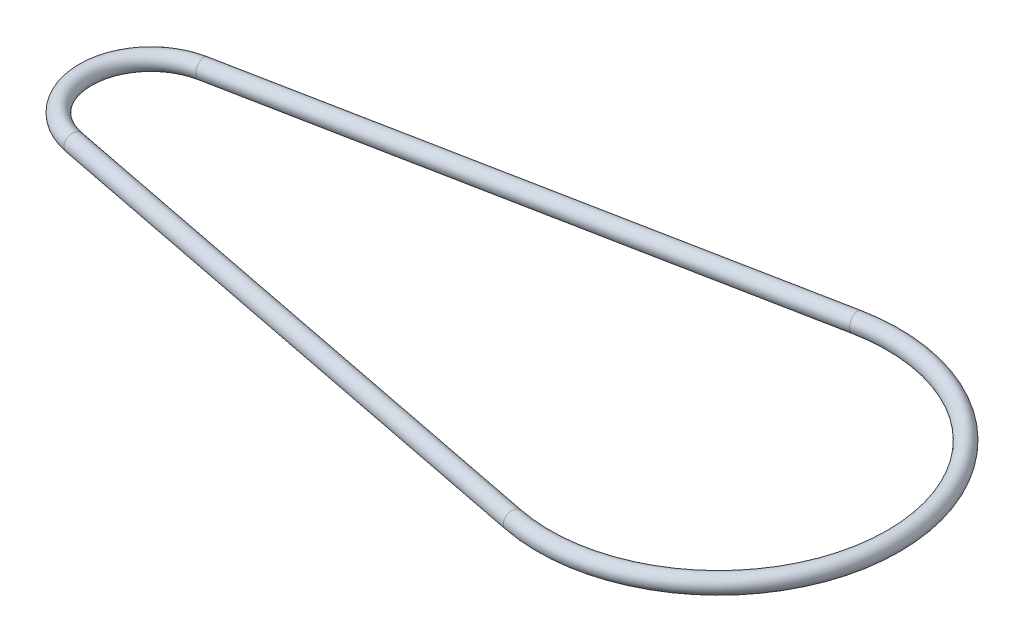
ISO-10303-21;
HEADER;
FILE_DESCRIPTION(('STEP AP214'),'2;1');
FILE_NAME('part.step','',(''),(''),'','','');
FILE_SCHEMA(('AUTOMOTIVE_DESIGN { 1 0 10303 214 1 1 1 1 }'));
ENDSEC;
DATA;
#1=APPLICATION_CONTEXT('core data for automotive mechanical design processes');
#2=APPLICATION_PROTOCOL_DEFINITION('international standard','automotive_design',2000,#1);
#3=PRODUCT_CONTEXT('',#1,'mechanical');
#4=PRODUCT('Part','Part','',(#3));
#5=PRODUCT_RELATED_PRODUCT_CATEGORY('part','',(#4));
#6=PRODUCT_DEFINITION_FORMATION('','',#4);
#7=PRODUCT_DEFINITION_CONTEXT('part definition',#1,'design');
#8=PRODUCT_DEFINITION('design','',#6,#7);
#9=PRODUCT_DEFINITION_SHAPE('','',#8);
#10=(LENGTH_UNIT() NAMED_UNIT(*) SI_UNIT(.MILLI.,.METRE.));
#11=(NAMED_UNIT(*) PLANE_ANGLE_UNIT() SI_UNIT($,.RADIAN.));
#12=(NAMED_UNIT(*) SI_UNIT($,.STERADIAN.) SOLID_ANGLE_UNIT());
#13=UNCERTAINTY_MEASURE_WITH_UNIT(LENGTH_MEASURE(1.E-05),#10,'distance_accuracy_value','');
#14=(GEOMETRIC_REPRESENTATION_CONTEXT(3) GLOBAL_UNCERTAINTY_ASSIGNED_CONTEXT((#13)) GLOBAL_UNIT_ASSIGNED_CONTEXT((#10,
#11,#12)) REPRESENTATION_CONTEXT('',''));
#15=CARTESIAN_POINT('',(0.,0.,0.));
#16=DIRECTION('',(0.,0.,1.));
#17=DIRECTION('',(1.,0.,0.));
#18=AXIS2_PLACEMENT_3D('',#15,#16,#17);
#19=CARTESIAN_POINT('',(0.,0.,0.));
#20=DIRECTION('',(0.,-1.,0.));
#21=DIRECTION('',(0.,0.,-1.));
#22=AXIS2_PLACEMENT_3D('',#19,#20,#21);
#23=TOROIDAL_SURFACE('',#22,7.5,1.);
#24=CARTESIAN_POINT('',(-1.44230769230795,0.,7.3600100897152));
#25=DIRECTION('',(-0.981334678628695,0.,-0.192307692307706));
#26=DIRECTION('',(-0.192307692307706,0.,0.981334678628695));
#27=AXIS2_PLACEMENT_3D('',#24,#25,#26);
#28=CIRCLE('',#27,1.);
#29=CARTESIAN_POINT('',(-1.63461538461564,0.,8.34134476834386));
#30=VERTEX_POINT('',#29);
#31=EDGE_CURVE('E25',#30,#30,#28,.T.);
#32=ORIENTED_EDGE('',*,*,#31,.T.);
#33=EDGE_LOOP('',(#32));
#34=FACE_BOUND('',#33,.T.);
#35=CARTESIAN_POINT('',(-1.44230769230766,0.,-7.36001008971521));
#36=DIRECTION('',(0.981334678628698,0.,-0.192307692307693));
#37=DIRECTION('',(-0.192307692307701,0.,-0.981334678628696));
#38=AXIS2_PLACEMENT_3D('',#35,#36,#37);
#39=CIRCLE('',#38,0.999999999999997);
#40=CARTESIAN_POINT('',(-1.63461538461536,0.,-8.3413447683439));
#41=VERTEX_POINT('',#40);
#42=EDGE_CURVE('E10',#41,#41,#39,.T.);
#43=ORIENTED_EDGE('',*,*,#42,.F.);
#44=EDGE_LOOP('',(#43));
#45=FACE_BOUND('',#44,.T.);
#46=ADVANCED_FACE('F15',(#34,#45),#23,.T.);
#47=CARTESIAN_POINT('',(61.1538461538459,0.,19.6266935725739));
#48=DIRECTION('',(-0.981334678628698,0.,-0.192307692307693));
#49=DIRECTION('',(-0.192307692307693,0.,0.981334678628698));
#50=AXIS2_PLACEMENT_3D('',#47,#48,#49);
#51=CYLINDRICAL_SURFACE('',#50,1.);
#52=CARTESIAN_POINT('',(61.1538461538459,0.,19.6266935725739));
#53=DIRECTION('',(-0.981334678628695,0.,-0.192307692307706));
#54=DIRECTION('',(-0.192307692307706,0.,0.981334678628695));
#55=AXIS2_PLACEMENT_3D('',#52,#53,#54);
#56=CIRCLE('',#55,1.);
#57=CARTESIAN_POINT('',(60.9615384615382,0.,20.6080282512026));
#58=VERTEX_POINT('',#57);
#59=EDGE_CURVE('E29',#58,#58,#56,.T.);
#60=CARTESIAN_POINT('',(60.9615384615382,0.,20.6080282512026));
#61=CARTESIAN_POINT('',(60.3094951923074,0.,20.4802502982562));
#62=CARTESIAN_POINT('',(59.6574519230767,0.,20.3524723453097));
#63=CARTESIAN_POINT('',(58.3533653846151,0.,20.0969164394168));
#64=CARTESIAN_POINT('',(57.7013221153844,0.,19.9691384864704));
#65=CARTESIAN_POINT('',(56.3972355769228,0.,19.7135825805775));
#66=CARTESIAN_POINT('',(55.745192307692,0.,19.585804627631));
#67=CARTESIAN_POINT('',(54.4411057692305,0.,19.3302487217381));
#68=CARTESIAN_POINT('',(53.7890624999997,0.,19.2024707687917));
#69=CARTESIAN_POINT('',(52.4849759615382,0.,18.9469148628988));
#70=CARTESIAN_POINT('',(51.8329326923074,0.,18.8191369099524));
#71=CARTESIAN_POINT('',(50.5288461538459,0.,18.5635810040595));
#72=CARTESIAN_POINT('',(49.8768028846151,0.,18.435803051113));
#73=CARTESIAN_POINT('',(48.5727163461536,0.,18.1802471452201));
#74=CARTESIAN_POINT('',(47.9206730769228,0.,18.0524691922737));
#75=CARTESIAN_POINT('',(46.6165865384613,0.,17.7969132863808));
#76=CARTESIAN_POINT('',(45.9645432692305,0.,17.6691353334344));
#77=CARTESIAN_POINT('',(44.660456730769,0.,17.4135794275415));
#78=CARTESIAN_POINT('',(44.0084134615382,0.,17.285801474595));
#79=CARTESIAN_POINT('',(42.7043269230767,0.,17.0302455687021));
#80=CARTESIAN_POINT('',(42.0522836538459,0.,16.9024676157557));
#81=CARTESIAN_POINT('',(40.7481971153844,0.,16.6469117098628));
#82=CARTESIAN_POINT('',(40.0961538461536,0.,16.5191337569164));
#83=CARTESIAN_POINT('',(38.7920673076921,0.,16.2635778510235));
#84=CARTESIAN_POINT('',(38.1400240384613,0.,16.135799898077));
#85=CARTESIAN_POINT('',(36.8359374999997,0.,15.8802439921841));
#86=CARTESIAN_POINT('',(36.183894230769,0.,15.7524660392377));
#87=CARTESIAN_POINT('',(34.8798076923074,0.,15.4969101333448));
#88=CARTESIAN_POINT('',(34.2277644230767,0.,15.3691321803983));
#89=CARTESIAN_POINT('',(32.9236778846151,0.,15.1135762745055));
#90=CARTESIAN_POINT('',(32.2716346153844,0.,14.985798321559));
#91=CARTESIAN_POINT('',(30.9675480769228,0.,14.7302424156661));
#92=CARTESIAN_POINT('',(30.315504807692,0.,14.6024644627197));
#93=CARTESIAN_POINT('',(29.0114182692305,0.,14.3469085568268));
#94=CARTESIAN_POINT('',(28.3593749999997,0.,14.2191306038803));
#95=CARTESIAN_POINT('',(27.0552884615382,0.,13.9635746979874));
#96=CARTESIAN_POINT('',(26.4032451923074,0.,13.835796745041));
#97=CARTESIAN_POINT('',(25.0991586538459,0.,13.5802408391481));
#98=CARTESIAN_POINT('',(24.4471153846151,0.,13.4524628862017));
#99=CARTESIAN_POINT('',(23.1430288461536,0.,13.1969069803088));
#100=CARTESIAN_POINT('',(22.4909855769228,0.,13.0691290273623));
#101=CARTESIAN_POINT('',(21.1868990384613,0.,12.8135731214694));
#102=CARTESIAN_POINT('',(20.5348557692305,0.,12.685795168523));
#103=CARTESIAN_POINT('',(19.230769230769,0.,12.4302392626301));
#104=CARTESIAN_POINT('',(18.5787259615382,0.,12.3024613096837));
#105=CARTESIAN_POINT('',(17.2746394230767,0.,12.0469054037908));
#106=CARTESIAN_POINT('',(16.6225961538459,0.,11.9191274508443));
#107=CARTESIAN_POINT('',(15.3185096153844,0.,11.6635715449514));
#108=CARTESIAN_POINT('',(14.6664663461536,0.,11.535793592005));
#109=CARTESIAN_POINT('',(13.3623798076921,0.,11.2802376861121));
#110=CARTESIAN_POINT('',(12.7103365384613,0.,11.1524597331657));
#111=CARTESIAN_POINT('',(11.4062499999997,0.,10.8969038272728));
#112=CARTESIAN_POINT('',(10.754206730769,0.,10.7691258743263));
#113=CARTESIAN_POINT('',(9.45012019230743,0.,10.5135699684334));
#114=CARTESIAN_POINT('',(8.79807692307666,0.,10.385792015487));
#115=CARTESIAN_POINT('',(7.49399038461512,0.,10.1302361095941));
#116=CARTESIAN_POINT('',(6.84194711538436,0.,10.0024581566476));
#117=CARTESIAN_POINT('',(5.53786057692282,0.,9.74690225075475));
#118=CARTESIAN_POINT('',(4.88581730769205,0.,9.61912429780831));
#119=CARTESIAN_POINT('',(3.58173076923051,0.,9.36356839191542));
#120=CARTESIAN_POINT('',(2.92968749999974,0.,9.23579043896897));
#121=CARTESIAN_POINT('',(1.6256009615382,0.,8.98023453307609));
#122=CARTESIAN_POINT('',(0.973557692307433,0.,8.85245658012964));
#123=CARTESIAN_POINT('',(-0.330528846154102,0.,8.59690067423675));
#124=CARTESIAN_POINT('',(-0.98257211538487,0.,8.4691227212903));
#125=CARTESIAN_POINT('',(-1.63461538461564,0.,8.34134476834386));
#126=B_SPLINE_CURVE_WITH_KNOTS('',3,(#60,#61,#62,#63,#64,#65,#66,#67,#68,#69,#70,#71,#72,#73,
#74,#75,#76,#77,#78,#79,#80,#81,#82,#83,#84,#85,#86,#87,#88,#89,#90,#91,#92,#93,#94,#95,#96,#97,
#98,#99,#100,#101,#102,#103,#104,#105,#106,#107,#108,#109,#110,#111,#112,#113,#114,#115,#116,
#117,#118,#119,#120,#121,#122,#123,#124,#125),.UNSPECIFIED.,.F.,.F.,(4,2,2,2,2,2,2,2,2,2,2,2,2,
2,2,2,2,2,2,2,2,2,2,2,2,2,2,2,2,2,2,2,4),(0.,1.99333606596454,3.98667213192909,5.98000819789363,
7.97334426385817,9.96668032982272,11.9600163957873,13.9533524617518,15.9466885277163,
17.9400245936809,19.9333606596454,21.92669672561,23.9200327915745,25.9133688575391,
27.9067049235036,29.9000409894681,31.8933770554327,33.8867131213972,35.8800491873618,
37.8733852533263,39.8667213192909,41.8600573852554,43.8533934512199,45.8467295171845,
47.840065583149,49.8334016491136,51.8267377150781,53.8200737810427,55.8134098470072,
57.8067459129717,59.8000819789363,61.7934180449008,63.7867541108654),.UNSPECIFIED.);
#127=EDGE_CURVE('BSEAM48',#58,#30,#126,.T.);
#128=ORIENTED_EDGE('',*,*,#59,.T.);
#129=ORIENTED_EDGE('',*,*,#31,.F.);
#130=ORIENTED_EDGE('',*,*,#127,.T.);
#131=ORIENTED_EDGE('',*,*,#127,.F.);
#132=EDGE_LOOP('',(#128,#130,#129,#131));
#133=FACE_BOUND('',#132,.T.);
#134=ADVANCED_FACE('F48',(#133),#51,.T.);
#135=CARTESIAN_POINT('',(65.,0.,0.));
#136=DIRECTION('',(0.,-1.,0.));
#137=DIRECTION('',(0.,0.,-1.));
#138=AXIS2_PLACEMENT_3D('',#135,#136,#137);
#139=TOROIDAL_SURFACE('',#138,20.,1.);
#140=CARTESIAN_POINT('',(61.1538461538462,0.,-19.626693572574));
#141=DIRECTION('',(0.981334678628698,0.,-0.192307692307693));
#142=DIRECTION('',(-0.192307692307693,0.,-0.981334678628698));
#143=AXIS2_PLACEMENT_3D('',#140,#141,#142);
#144=CIRCLE('',#143,1.);
#145=CARTESIAN_POINT('',(60.9615384615385,0.,-20.6080282512027));
#146=VERTEX_POINT('',#145);
#147=EDGE_CURVE('E34',#146,#146,#144,.T.);
#148=CARTESIAN_POINT('',(65.,0.,0.));
#149=DIRECTION('',(0.,-1.,0.));
#150=DIRECTION('',(0.,0.,-1.));
#151=AXIS2_PLACEMENT_3D('',#148,#149,#150);
#152=CIRCLE('',#151,21.);
#153=EDGE_CURVE('',#146,#58,#152,.T.);
#154=ORIENTED_EDGE('',*,*,#147,.T.);
#155=ORIENTED_EDGE('',*,*,#59,.F.);
#156=ORIENTED_EDGE('',*,*,#153,.T.);
#157=ORIENTED_EDGE('',*,*,#153,.F.);
#158=EDGE_LOOP('',(#154,#156,#155,#157));
#159=FACE_BOUND('',#158,.T.);
#160=ADVANCED_FACE('F54',(#159),#139,.T.);
#161=CARTESIAN_POINT('',(61.1538461538462,0.,-19.626693572574));
#162=DIRECTION('',(-0.981334678628698,0.,0.192307692307693));
#163=DIRECTION('',(0.192307692307693,0.,0.981334678628698));
#164=AXIS2_PLACEMENT_3D('',#161,#162,#163);
#165=CYLINDRICAL_SURFACE('',#164,1.);
#166=ORIENTED_EDGE('',*,*,#147,.F.);
#167=EDGE_LOOP('',(#166));
#168=FACE_BOUND('',#167,.T.);
#169=ORIENTED_EDGE('',*,*,#42,.T.);
#170=EDGE_LOOP('',(#169));
#171=FACE_BOUND('',#170,.T.);
#172=ADVANCED_FACE('F60',(#168,#171),#165,.T.);
#173=CLOSED_SHELL('',(#46,#134,#160,#172));
#174=MANIFOLD_SOLID_BREP('B1',#173);
#175=ADVANCED_BREP_SHAPE_REPRESENTATION('',(#18,#174),#14);
#176=SHAPE_DEFINITION_REPRESENTATION(#9,#175);
ENDSEC;
END-ISO-10303-21;
